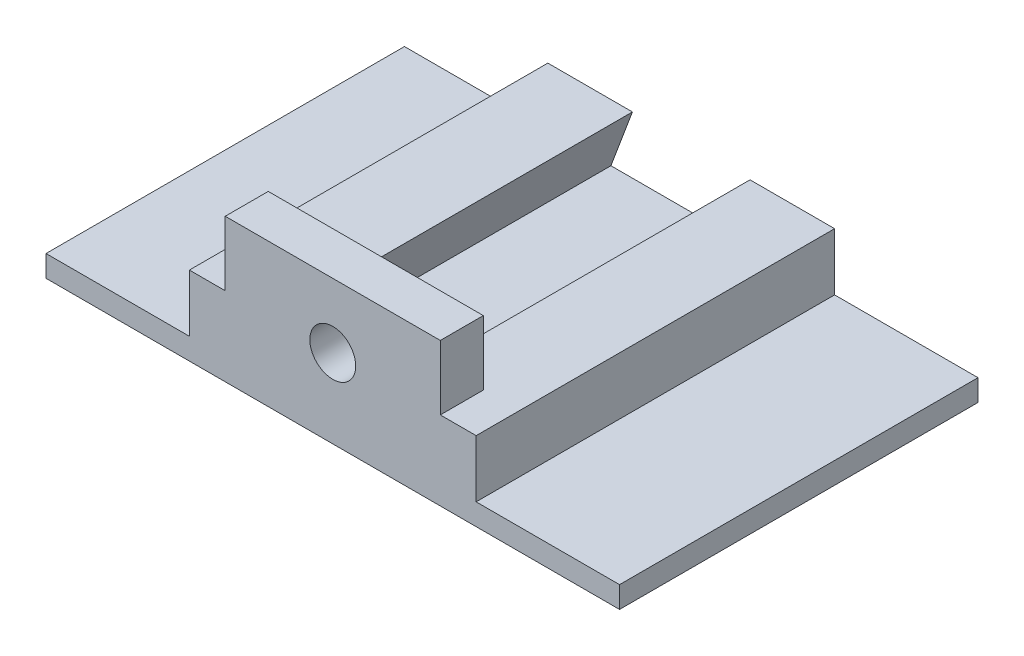
ISO-10303-21;
HEADER;
FILE_DESCRIPTION(('STEP AP214'),'2;1');
FILE_NAME('part.step','',(''),(''),'','','');
FILE_SCHEMA(('AUTOMOTIVE_DESIGN { 1 0 10303 214 1 1 1 1 }'));
ENDSEC;
DATA;
#1=APPLICATION_CONTEXT('core data for automotive mechanical design processes');
#2=APPLICATION_PROTOCOL_DEFINITION('international standard','automotive_design',2000,#1);
#3=PRODUCT_CONTEXT('',#1,'mechanical');
#4=PRODUCT('Part','Part','',(#3));
#5=PRODUCT_RELATED_PRODUCT_CATEGORY('part','',(#4));
#6=PRODUCT_DEFINITION_FORMATION('','',#4);
#7=PRODUCT_DEFINITION_CONTEXT('part definition',#1,'design');
#8=PRODUCT_DEFINITION('design','',#6,#7);
#9=PRODUCT_DEFINITION_SHAPE('','',#8);
#10=(LENGTH_UNIT() NAMED_UNIT(*) SI_UNIT(.MILLI.,.METRE.));
#11=(NAMED_UNIT(*) PLANE_ANGLE_UNIT() SI_UNIT($,.RADIAN.));
#12=(NAMED_UNIT(*) SI_UNIT($,.STERADIAN.) SOLID_ANGLE_UNIT());
#13=UNCERTAINTY_MEASURE_WITH_UNIT(LENGTH_MEASURE(1.E-05),#10,'distance_accuracy_value','');
#14=(GEOMETRIC_REPRESENTATION_CONTEXT(3) GLOBAL_UNCERTAINTY_ASSIGNED_CONTEXT((#13)) GLOBAL_UNIT_ASSIGNED_CONTEXT((#10,
#11,#12)) REPRESENTATION_CONTEXT('',''));
#15=CARTESIAN_POINT('',(0.,0.,0.));
#16=DIRECTION('',(0.,0.,1.));
#17=DIRECTION('',(1.,0.,0.));
#18=AXIS2_PLACEMENT_3D('',#15,#16,#17);
#19=CARTESIAN_POINT('',(0.,0.,25.));
#20=DIRECTION('',(1.,0.,0.));
#21=DIRECTION('',(0.,0.,-1.));
#22=AXIS2_PLACEMENT_3D('',#19,#20,#21);
#23=PLANE('',#22);
#24=DIRECTION('',(0.,-1.,0.));
#25=VECTOR('',#24,1.);
#26=CARTESIAN_POINT('',(0.,0.,25.));
#27=LINE('',#26,#25);
#28=CARTESIAN_POINT('',(0.,1.50000000000001,25.));
#29=VERTEX_POINT('',#28);
#30=CARTESIAN_POINT('',(0.,0.,25.));
#31=VERTEX_POINT('',#30);
#32=EDGE_CURVE('E157',#29,#31,#27,.T.);
#33=ORIENTED_EDGE('',*,*,#32,.F.);
#34=DIRECTION('',(0.,0.,1.));
#35=VECTOR('',#34,1.);
#36=CARTESIAN_POINT('',(0.,1.50000000000001,-8.00000000000001));
#37=LINE('',#36,#35);
#38=CARTESIAN_POINT('',(0.,1.50000000000001,0.));
#39=VERTEX_POINT('',#38);
#40=EDGE_CURVE('E142',#39,#29,#37,.T.);
#41=ORIENTED_EDGE('',*,*,#40,.F.);
#42=DIRECTION('',(0.,-1.,0.));
#43=VECTOR('',#42,1.);
#44=CARTESIAN_POINT('',(0.,0.,0.));
#45=LINE('',#44,#43);
#46=CARTESIAN_POINT('',(0.,0.,0.));
#47=VERTEX_POINT('',#46);
#48=EDGE_CURVE('E183',#39,#47,#45,.T.);
#49=ORIENTED_EDGE('',*,*,#48,.T.);
#50=DIRECTION('',(0.,0.,-1.));
#51=VECTOR('',#50,1.);
#52=CARTESIAN_POINT('',(0.,0.,25.));
#53=LINE('',#52,#51);
#54=EDGE_CURVE('E163',#31,#47,#53,.T.);
#55=ORIENTED_EDGE('',*,*,#54,.F.);
#56=EDGE_LOOP('',(#33,#41,#49,#55));
#57=FACE_BOUND('',#56,.T.);
#58=ADVANCED_FACE('F33',(#57),#23,.F.);
#59=CARTESIAN_POINT('',(0.,0.,25.));
#60=DIRECTION('',(0.,1.,0.));
#61=DIRECTION('',(-1.,0.,0.));
#62=AXIS2_PLACEMENT_3D('',#59,#60,#61);
#63=PLANE('',#62);
#64=DIRECTION('',(0.,0.,-1.));
#65=VECTOR('',#64,1.);
#66=CARTESIAN_POINT('',(40.,0.,25.));
#67=LINE('',#66,#65);
#68=CARTESIAN_POINT('',(40.,0.,25.));
#69=VERTEX_POINT('',#68);
#70=CARTESIAN_POINT('',(40.,0.,0.));
#71=VERTEX_POINT('',#70);
#72=EDGE_CURVE('E208',#69,#71,#67,.T.);
#73=ORIENTED_EDGE('',*,*,#72,.F.);
#74=DIRECTION('',(1.,0.,0.));
#75=VECTOR('',#74,1.);
#76=CARTESIAN_POINT('',(0.,0.,25.));
#77=LINE('',#76,#75);
#78=EDGE_CURVE('E164',#31,#69,#77,.T.);
#79=ORIENTED_EDGE('',*,*,#78,.F.);
#80=ORIENTED_EDGE('',*,*,#54,.T.);
#81=DIRECTION('',(1.,0.,0.));
#82=VECTOR('',#81,1.);
#83=CARTESIAN_POINT('',(0.,0.,0.));
#84=LINE('',#83,#82);
#85=EDGE_CURVE('E185',#47,#71,#84,.T.);
#86=ORIENTED_EDGE('',*,*,#85,.T.);
#87=EDGE_LOOP('',(#73,#79,#80,#86));
#88=FACE_BOUND('',#87,.T.);
#89=ADVANCED_FACE('F309',(#88),#63,.F.);
#90=CARTESIAN_POINT('',(40.,0.,25.));
#91=DIRECTION('',(-1.,0.,0.));
#92=DIRECTION('',(0.,0.,1.));
#93=AXIS2_PLACEMENT_3D('',#90,#91,#92);
#94=PLANE('',#93);
#95=DIRECTION('',(0.,1.,0.));
#96=VECTOR('',#95,1.);
#97=CARTESIAN_POINT('',(40.,0.,0.));
#98=LINE('',#97,#96);
#99=CARTESIAN_POINT('',(40.,1.50000000000001,0.));
#100=VERTEX_POINT('',#99);
#101=EDGE_CURVE('E187',#71,#100,#98,.T.);
#102=ORIENTED_EDGE('',*,*,#101,.T.);
#103=DIRECTION('',(0.,0.,1.));
#104=VECTOR('',#103,1.);
#105=CARTESIAN_POINT('',(40.,1.50000000000001,-8.00000000000001));
#106=LINE('',#105,#104);
#107=CARTESIAN_POINT('',(40.,1.50000000000001,25.));
#108=VERTEX_POINT('',#107);
#109=EDGE_CURVE('E159',#100,#108,#106,.T.);
#110=ORIENTED_EDGE('',*,*,#109,.T.);
#111=DIRECTION('',(0.,1.,0.));
#112=VECTOR('',#111,1.);
#113=CARTESIAN_POINT('',(40.,0.,25.));
#114=LINE('',#113,#112);
#115=EDGE_CURVE('E167',#69,#108,#114,.T.);
#116=ORIENTED_EDGE('',*,*,#115,.F.);
#117=ORIENTED_EDGE('',*,*,#72,.T.);
#118=EDGE_LOOP('',(#102,#110,#116,#117));
#119=FACE_BOUND('',#118,.T.);
#120=ADVANCED_FACE('F306',(#119),#94,.F.);
#121=CARTESIAN_POINT('',(24.1,5.50000000000001,25.));
#122=DIRECTION('',(0.,-1.,0.));
#123=DIRECTION('',(1.,0.,0.));
#124=AXIS2_PLACEMENT_3D('',#121,#122,#123);
#125=PLANE('',#124);
#126=DIRECTION('',(-1.,0.,0.));
#127=VECTOR('',#126,1.);
#128=CARTESIAN_POINT('',(24.1,5.50000000000001,25.));
#129=LINE('',#128,#127);
#130=CARTESIAN_POINT('',(30.,5.5,25.));
#131=VERTEX_POINT('',#130);
#132=CARTESIAN_POINT('',(27.5,5.50000000000001,25.));
#133=VERTEX_POINT('',#132);
#134=EDGE_CURVE('E178',#131,#133,#129,.T.);
#135=ORIENTED_EDGE('',*,*,#134,.F.);
#136=DIRECTION('',(0.,0.,1.));
#137=VECTOR('',#136,1.);
#138=CARTESIAN_POINT('',(30.,5.5,-8.00000000000001));
#139=LINE('',#138,#137);
#140=CARTESIAN_POINT('',(30.,5.5,0.));
#141=VERTEX_POINT('',#140);
#142=EDGE_CURVE('E231',#141,#131,#139,.T.);
#143=ORIENTED_EDGE('',*,*,#142,.F.);
#144=DIRECTION('',(-1.,0.,0.));
#145=VECTOR('',#144,1.);
#146=CARTESIAN_POINT('',(24.1,5.50000000000001,0.));
#147=LINE('',#146,#145);
#148=CARTESIAN_POINT('',(24.1,5.50000000000001,0.));
#149=VERTEX_POINT('',#148);
#150=EDGE_CURVE('E190',#141,#149,#147,.T.);
#151=ORIENTED_EDGE('',*,*,#150,.T.);
#152=DIRECTION('',(0.,0.,-1.));
#153=VECTOR('',#152,1.);
#154=CARTESIAN_POINT('',(24.1,5.50000000000001,25.));
#155=LINE('',#154,#153);
#156=CARTESIAN_POINT('',(24.1,5.50000000000001,22.));
#157=VERTEX_POINT('',#156);
#158=EDGE_CURVE('E205',#157,#149,#155,.T.);
#159=ORIENTED_EDGE('',*,*,#158,.F.);
#160=DIRECTION('',(1.,0.,0.));
#161=VECTOR('',#160,1.);
#162=CARTESIAN_POINT('',(24.1,5.50000000000001,22.));
#163=LINE('',#162,#161);
#164=CARTESIAN_POINT('',(27.5,5.50000000000001,22.));
#165=VERTEX_POINT('',#164);
#166=EDGE_CURVE('E173',#157,#165,#163,.T.);
#167=ORIENTED_EDGE('',*,*,#166,.T.);
#168=DIRECTION('',(0.,0.,1.));
#169=VECTOR('',#168,1.);
#170=CARTESIAN_POINT('',(27.5,5.50000000000001,25.));
#171=LINE('',#170,#169);
#172=EDGE_CURVE('E270',#165,#133,#171,.T.);
#173=ORIENTED_EDGE('',*,*,#172,.T.);
#174=EDGE_LOOP('',(#135,#143,#151,#159,#167,#173));
#175=FACE_BOUND('',#174,.T.);
#176=ADVANCED_FACE('F235',(#175),#125,.F.);
#177=CARTESIAN_POINT('',(25.6,1.50000000000001,25.));
#178=DIRECTION('',(0.936329177569044,0.351123441588393,0.));
#179=DIRECTION('',(-0.351123441588393,0.936329177569044,0.));
#180=AXIS2_PLACEMENT_3D('',#177,#178,#179);
#181=PLANE('',#180);
#182=DIRECTION('',(0.,0.,-1.));
#183=VECTOR('',#182,1.);
#184=CARTESIAN_POINT('',(25.6,1.50000000000001,25.));
#185=LINE('',#184,#183);
#186=CARTESIAN_POINT('',(25.6,1.50000000000001,22.));
#187=VERTEX_POINT('',#186);
#188=CARTESIAN_POINT('',(25.6,1.50000000000001,0.));
#189=VERTEX_POINT('',#188);
#190=EDGE_CURVE('E203',#187,#189,#185,.T.);
#191=ORIENTED_EDGE('',*,*,#190,.F.);
#192=DIRECTION('',(-0.351123441588393,0.936329177569044,0.));
#193=VECTOR('',#192,1.);
#194=CARTESIAN_POINT('',(25.6,1.50000000000001,22.));
#195=LINE('',#194,#193);
#196=EDGE_CURVE('E282',#187,#157,#195,.T.);
#197=ORIENTED_EDGE('',*,*,#196,.T.);
#198=ORIENTED_EDGE('',*,*,#158,.T.);
#199=DIRECTION('',(0.351123441588393,-0.936329177569044,0.));
#200=VECTOR('',#199,1.);
#201=CARTESIAN_POINT('',(25.6,1.50000000000001,0.));
#202=LINE('',#201,#200);
#203=EDGE_CURVE('E192',#149,#189,#202,.T.);
#204=ORIENTED_EDGE('',*,*,#203,.T.);
#205=EDGE_LOOP('',(#191,#197,#198,#204));
#206=FACE_BOUND('',#205,.T.);
#207=ADVANCED_FACE('F325',(#206),#181,.F.);
#208=CARTESIAN_POINT('',(14.4,1.5,25.));
#209=DIRECTION('',(0.,-1.,0.));
#210=DIRECTION('',(1.,0.,0.));
#211=AXIS2_PLACEMENT_3D('',#208,#209,#210);
#212=PLANE('',#211);
#213=DIRECTION('',(0.,0.,-1.));
#214=VECTOR('',#213,1.);
#215=CARTESIAN_POINT('',(14.4,1.5,25.));
#216=LINE('',#215,#214);
#217=CARTESIAN_POINT('',(14.4,1.50000000000001,22.));
#218=VERTEX_POINT('',#217);
#219=CARTESIAN_POINT('',(14.4,1.5,0.));
#220=VERTEX_POINT('',#219);
#221=EDGE_CURVE('E201',#218,#220,#216,.T.);
#222=ORIENTED_EDGE('',*,*,#221,.F.);
#223=DIRECTION('',(1.,0.,0.));
#224=VECTOR('',#223,1.);
#225=CARTESIAN_POINT('',(14.4,1.5,22.));
#226=LINE('',#225,#224);
#227=EDGE_CURVE('E280',#218,#187,#226,.T.);
#228=ORIENTED_EDGE('',*,*,#227,.T.);
#229=ORIENTED_EDGE('',*,*,#190,.T.);
#230=DIRECTION('',(-1.,0.,0.));
#231=VECTOR('',#230,1.);
#232=CARTESIAN_POINT('',(14.4,1.5,0.));
#233=LINE('',#232,#231);
#234=EDGE_CURVE('E195',#189,#220,#233,.T.);
#235=ORIENTED_EDGE('',*,*,#234,.T.);
#236=EDGE_LOOP('',(#222,#228,#229,#235));
#237=FACE_BOUND('',#236,.T.);
#238=ADVANCED_FACE('F324',(#237),#212,.F.);
#239=CARTESIAN_POINT('',(15.9,5.50000000000001,25.));
#240=DIRECTION('',(-0.936329177569044,0.351123441588392,0.));
#241=DIRECTION('',(-0.351123441588392,-0.936329177569045,0.));
#242=AXIS2_PLACEMENT_3D('',#239,#240,#241);
#243=PLANE('',#242);
#244=DIRECTION('',(0.,0.,-1.));
#245=VECTOR('',#244,1.);
#246=CARTESIAN_POINT('',(15.9,5.50000000000001,25.));
#247=LINE('',#246,#245);
#248=CARTESIAN_POINT('',(15.9,5.50000000000001,22.));
#249=VERTEX_POINT('',#248);
#250=CARTESIAN_POINT('',(15.9,5.50000000000001,0.));
#251=VERTEX_POINT('',#250);
#252=EDGE_CURVE('E182',#249,#251,#247,.T.);
#253=ORIENTED_EDGE('',*,*,#252,.F.);
#254=DIRECTION('',(-0.351123441588392,-0.936329177569045,0.));
#255=VECTOR('',#254,1.);
#256=CARTESIAN_POINT('',(15.9,5.50000000000001,22.));
#257=LINE('',#256,#255);
#258=EDGE_CURVE('E277',#249,#218,#257,.T.);
#259=ORIENTED_EDGE('',*,*,#258,.T.);
#260=ORIENTED_EDGE('',*,*,#221,.T.);
#261=DIRECTION('',(0.351123441588392,0.936329177569045,0.));
#262=VECTOR('',#261,1.);
#263=CARTESIAN_POINT('',(15.9,5.50000000000001,0.));
#264=LINE('',#263,#262);
#265=EDGE_CURVE('E170',#220,#251,#264,.T.);
#266=ORIENTED_EDGE('',*,*,#265,.T.);
#267=EDGE_LOOP('',(#253,#259,#260,#266));
#268=FACE_BOUND('',#267,.T.);
#269=ADVANCED_FACE('F320',(#268),#243,.F.);
#270=CARTESIAN_POINT('',(0.,5.5,25.));
#271=DIRECTION('',(0.,-1.,0.));
#272=DIRECTION('',(1.,0.,0.));
#273=AXIS2_PLACEMENT_3D('',#270,#271,#272);
#274=PLANE('',#273);
#275=DIRECTION('',(-1.,0.,0.));
#276=VECTOR('',#275,1.);
#277=CARTESIAN_POINT('',(0.,5.5,0.));
#278=LINE('',#277,#276);
#279=CARTESIAN_POINT('',(10.,5.5,0.));
#280=VERTEX_POINT('',#279);
#281=EDGE_CURVE('E165',#251,#280,#278,.T.);
#282=ORIENTED_EDGE('',*,*,#281,.T.);
#283=DIRECTION('',(0.,0.,1.));
#284=VECTOR('',#283,1.);
#285=CARTESIAN_POINT('',(10.,5.5,-8.00000000000001));
#286=LINE('',#285,#284);
#287=CARTESIAN_POINT('',(10.,5.5,25.));
#288=VERTEX_POINT('',#287);
#289=EDGE_CURVE('E252',#280,#288,#286,.T.);
#290=ORIENTED_EDGE('',*,*,#289,.T.);
#291=DIRECTION('',(-1.,0.,0.));
#292=VECTOR('',#291,1.);
#293=CARTESIAN_POINT('',(0.,5.5,25.));
#294=LINE('',#293,#292);
#295=CARTESIAN_POINT('',(12.5,5.5,25.));
#296=VERTEX_POINT('',#295);
#297=EDGE_CURVE('E180',#296,#288,#294,.T.);
#298=ORIENTED_EDGE('',*,*,#297,.F.);
#299=DIRECTION('',(0.,0.,-1.));
#300=VECTOR('',#299,1.);
#301=CARTESIAN_POINT('',(12.5,5.5,25.));
#302=LINE('',#301,#300);
#303=CARTESIAN_POINT('',(12.5,5.50000000000001,22.));
#304=VERTEX_POINT('',#303);
#305=EDGE_CURVE('E274',#296,#304,#302,.T.);
#306=ORIENTED_EDGE('',*,*,#305,.T.);
#307=DIRECTION('',(1.,0.,0.));
#308=VECTOR('',#307,1.);
#309=CARTESIAN_POINT('',(0.,5.5,22.));
#310=LINE('',#309,#308);
#311=EDGE_CURVE('E212',#304,#249,#310,.T.);
#312=ORIENTED_EDGE('',*,*,#311,.T.);
#313=ORIENTED_EDGE('',*,*,#252,.T.);
#314=EDGE_LOOP('',(#282,#290,#298,#306,#312,#313));
#315=FACE_BOUND('',#314,.T.);
#316=ADVANCED_FACE('F316',(#315),#274,.F.);
#317=CARTESIAN_POINT('',(0.,0.,25.));
#318=DIRECTION('',(0.,0.,-1.));
#319=DIRECTION('',(-1.,0.,0.));
#320=AXIS2_PLACEMENT_3D('',#317,#318,#319);
#321=PLANE('',#320);
#322=ORIENTED_EDGE('',*,*,#297,.T.);
#323=DIRECTION('',(0.,1.,0.));
#324=VECTOR('',#323,1.);
#325=CARTESIAN_POINT('',(10.,5.5,25.));
#326=LINE('',#325,#324);
#327=CARTESIAN_POINT('',(10.,1.50000000000001,25.));
#328=VERTEX_POINT('',#327);
#329=EDGE_CURVE('E151',#328,#288,#326,.T.);
#330=ORIENTED_EDGE('',*,*,#329,.F.);
#331=DIRECTION('',(1.,0.,0.));
#332=VECTOR('',#331,1.);
#333=CARTESIAN_POINT('',(0.,1.50000000000001,25.));
#334=LINE('',#333,#332);
#335=EDGE_CURVE('E145',#29,#328,#334,.T.);
#336=ORIENTED_EDGE('',*,*,#335,.F.);
#337=ORIENTED_EDGE('',*,*,#32,.T.);
#338=ORIENTED_EDGE('',*,*,#78,.T.);
#339=ORIENTED_EDGE('',*,*,#115,.T.);
#340=DIRECTION('',(1.,0.,0.));
#341=VECTOR('',#340,1.);
#342=CARTESIAN_POINT('',(40.,1.50000000000001,25.));
#343=LINE('',#342,#341);
#344=CARTESIAN_POINT('',(30.,1.50000000000001,25.));
#345=VERTEX_POINT('',#344);
#346=EDGE_CURVE('E238',#345,#108,#343,.T.);
#347=ORIENTED_EDGE('',*,*,#346,.F.);
#348=DIRECTION('',(0.,-1.,0.));
#349=VECTOR('',#348,1.);
#350=CARTESIAN_POINT('',(30.,5.5,25.));
#351=LINE('',#350,#349);
#352=EDGE_CURVE('E241',#131,#345,#351,.T.);
#353=ORIENTED_EDGE('',*,*,#352,.F.);
#354=ORIENTED_EDGE('',*,*,#134,.T.);
#355=DIRECTION('',(0.,1.,0.));
#356=VECTOR('',#355,1.);
#357=CARTESIAN_POINT('',(27.5,0.,25.));
#358=LINE('',#357,#356);
#359=CARTESIAN_POINT('',(27.5,10.,25.));
#360=VERTEX_POINT('',#359);
#361=EDGE_CURVE('E264',#133,#360,#358,.T.);
#362=ORIENTED_EDGE('',*,*,#361,.T.);
#363=DIRECTION('',(-1.,0.,0.));
#364=VECTOR('',#363,1.);
#365=CARTESIAN_POINT('',(12.5,10.,25.));
#366=LINE('',#365,#364);
#367=CARTESIAN_POINT('',(12.5,10.,25.));
#368=VERTEX_POINT('',#367);
#369=EDGE_CURVE('E257',#360,#368,#366,.T.);
#370=ORIENTED_EDGE('',*,*,#369,.T.);
#371=DIRECTION('',(0.,-1.,0.));
#372=VECTOR('',#371,1.);
#373=CARTESIAN_POINT('',(12.5,0.,25.));
#374=LINE('',#373,#372);
#375=EDGE_CURVE('E248',#368,#296,#374,.T.);
#376=ORIENTED_EDGE('',*,*,#375,.T.);
#377=EDGE_LOOP('',(#322,#330,#336,#337,#338,#339,#347,#353,#354,#362,#370,#376));
#378=FACE_BOUND('',#377,.T.);
#379=CARTESIAN_POINT('',(20.,5.50000000000001,25.));
#380=DIRECTION('',(0.,0.,1.));
#381=DIRECTION('',(1.,0.,0.));
#382=AXIS2_PLACEMENT_3D('',#379,#380,#381);
#383=CIRCLE('',#382,1.6);
#384=CARTESIAN_POINT('',(21.6,5.50000000000001,25.));
#385=VERTEX_POINT('',#384);
#386=EDGE_CURVE('E249',#385,#385,#383,.T.);
#387=ORIENTED_EDGE('',*,*,#386,.F.);
#388=EDGE_LOOP('',(#387));
#389=FACE_BOUND('',#388,.T.);
#390=ADVANCED_FACE('F155',(#378,#389),#321,.F.);
#391=CARTESIAN_POINT('',(0.,0.,0.));
#392=DIRECTION('',(0.,0.,-1.));
#393=DIRECTION('',(-1.,0.,0.));
#394=AXIS2_PLACEMENT_3D('',#391,#392,#393);
#395=PLANE('',#394);
#396=DIRECTION('',(0.,-1.,0.));
#397=VECTOR('',#396,1.);
#398=CARTESIAN_POINT('',(10.,0.,0.));
#399=LINE('',#398,#397);
#400=CARTESIAN_POINT('',(10.,1.50000000000001,0.));
#401=VERTEX_POINT('',#400);
#402=EDGE_CURVE('E11',#280,#401,#399,.T.);
#403=ORIENTED_EDGE('',*,*,#402,.F.);
#404=ORIENTED_EDGE('',*,*,#281,.F.);
#405=ORIENTED_EDGE('',*,*,#265,.F.);
#406=ORIENTED_EDGE('',*,*,#234,.F.);
#407=ORIENTED_EDGE('',*,*,#203,.F.);
#408=ORIENTED_EDGE('',*,*,#150,.F.);
#409=DIRECTION('',(0.,1.,0.));
#410=VECTOR('',#409,1.);
#411=CARTESIAN_POINT('',(30.,0.,0.));
#412=LINE('',#411,#410);
#413=CARTESIAN_POINT('',(30.,1.50000000000001,0.));
#414=VERTEX_POINT('',#413);
#415=EDGE_CURVE('E215',#414,#141,#412,.T.);
#416=ORIENTED_EDGE('',*,*,#415,.F.);
#417=DIRECTION('',(-1.,0.,0.));
#418=VECTOR('',#417,1.);
#419=CARTESIAN_POINT('',(0.,1.50000000000001,0.));
#420=LINE('',#419,#418);
#421=EDGE_CURVE('E217',#100,#414,#420,.T.);
#422=ORIENTED_EDGE('',*,*,#421,.F.);
#423=ORIENTED_EDGE('',*,*,#101,.F.);
#424=ORIENTED_EDGE('',*,*,#85,.F.);
#425=ORIENTED_EDGE('',*,*,#48,.F.);
#426=DIRECTION('',(-1.,0.,0.));
#427=VECTOR('',#426,1.);
#428=CARTESIAN_POINT('',(0.,1.50000000000001,0.));
#429=LINE('',#428,#427);
#430=EDGE_CURVE('E40',#401,#39,#429,.T.);
#431=ORIENTED_EDGE('',*,*,#430,.F.);
#432=EDGE_LOOP('',(#403,#404,#405,#406,#407,#408,#416,#422,#423,#424,#425,#431));
#433=FACE_BOUND('',#432,.T.);
#434=ADVANCED_FACE('F227',(#433),#395,.T.);
#435=CARTESIAN_POINT('',(0.,0.,22.));
#436=DIRECTION('',(0.,0.,-1.));
#437=DIRECTION('',(-1.,0.,0.));
#438=AXIS2_PLACEMENT_3D('',#435,#436,#437);
#439=PLANE('',#438);
#440=CARTESIAN_POINT('',(20.,5.50000000000001,22.));
#441=DIRECTION('',(0.,0.,1.));
#442=DIRECTION('',(1.,0.,0.));
#443=AXIS2_PLACEMENT_3D('',#440,#441,#442);
#444=CIRCLE('',#443,1.6);
#445=CARTESIAN_POINT('',(21.6,5.50000000000001,22.));
#446=VERTEX_POINT('',#445);
#447=EDGE_CURVE('E245',#446,#446,#444,.T.);
#448=ORIENTED_EDGE('',*,*,#447,.T.);
#449=EDGE_LOOP('',(#448));
#450=FACE_BOUND('',#449,.T.);
#451=ORIENTED_EDGE('',*,*,#166,.F.);
#452=ORIENTED_EDGE('',*,*,#196,.F.);
#453=ORIENTED_EDGE('',*,*,#227,.F.);
#454=ORIENTED_EDGE('',*,*,#258,.F.);
#455=ORIENTED_EDGE('',*,*,#311,.F.);
#456=DIRECTION('',(0.,-1.,0.));
#457=VECTOR('',#456,1.);
#458=CARTESIAN_POINT('',(12.5,0.,22.));
#459=LINE('',#458,#457);
#460=CARTESIAN_POINT('',(12.5,10.,22.));
#461=VERTEX_POINT('',#460);
#462=EDGE_CURVE('E253',#461,#304,#459,.T.);
#463=ORIENTED_EDGE('',*,*,#462,.F.);
#464=DIRECTION('',(-1.,0.,0.));
#465=VECTOR('',#464,1.);
#466=CARTESIAN_POINT('',(12.5,10.,22.));
#467=LINE('',#466,#465);
#468=CARTESIAN_POINT('',(27.5,10.,22.));
#469=VERTEX_POINT('',#468);
#470=EDGE_CURVE('E259',#469,#461,#467,.T.);
#471=ORIENTED_EDGE('',*,*,#470,.F.);
#472=DIRECTION('',(0.,1.,0.));
#473=VECTOR('',#472,1.);
#474=CARTESIAN_POINT('',(27.5,0.,22.));
#475=LINE('',#474,#473);
#476=EDGE_CURVE('E256',#165,#469,#475,.T.);
#477=ORIENTED_EDGE('',*,*,#476,.F.);
#478=EDGE_LOOP('',(#451,#452,#453,#454,#455,#463,#471,#477));
#479=FACE_BOUND('',#478,.T.);
#480=ADVANCED_FACE('F289',(#450,#479),#439,.T.);
#481=CARTESIAN_POINT('',(12.5,0.,22.));
#482=DIRECTION('',(-1.,0.,0.));
#483=DIRECTION('',(0.,0.,1.));
#484=AXIS2_PLACEMENT_3D('',#481,#482,#483);
#485=PLANE('',#484);
#486=ORIENTED_EDGE('',*,*,#305,.F.);
#487=ORIENTED_EDGE('',*,*,#375,.F.);
#488=DIRECTION('',(0.,0.,1.));
#489=VECTOR('',#488,1.);
#490=CARTESIAN_POINT('',(12.5,10.,22.));
#491=LINE('',#490,#489);
#492=EDGE_CURVE('E268',#461,#368,#491,.T.);
#493=ORIENTED_EDGE('',*,*,#492,.F.);
#494=ORIENTED_EDGE('',*,*,#462,.T.);
#495=EDGE_LOOP('',(#486,#487,#493,#494));
#496=FACE_BOUND('',#495,.T.);
#497=ADVANCED_FACE('F422',(#496),#485,.T.);
#498=CARTESIAN_POINT('',(27.5,0.,22.));
#499=DIRECTION('',(1.,0.,0.));
#500=DIRECTION('',(0.,0.,-1.));
#501=AXIS2_PLACEMENT_3D('',#498,#499,#500);
#502=PLANE('',#501);
#503=ORIENTED_EDGE('',*,*,#172,.F.);
#504=ORIENTED_EDGE('',*,*,#476,.T.);
#505=DIRECTION('',(0.,0.,1.));
#506=VECTOR('',#505,1.);
#507=CARTESIAN_POINT('',(27.5,10.,22.));
#508=LINE('',#507,#506);
#509=EDGE_CURVE('E262',#469,#360,#508,.T.);
#510=ORIENTED_EDGE('',*,*,#509,.T.);
#511=ORIENTED_EDGE('',*,*,#361,.F.);
#512=EDGE_LOOP('',(#503,#504,#510,#511));
#513=FACE_BOUND('',#512,.T.);
#514=ADVANCED_FACE('F294',(#513),#502,.T.);
#515=CARTESIAN_POINT('',(12.5,10.,22.));
#516=DIRECTION('',(0.,1.,0.));
#517=DIRECTION('',(0.,0.,1.));
#518=AXIS2_PLACEMENT_3D('',#515,#516,#517);
#519=PLANE('',#518);
#520=ORIENTED_EDGE('',*,*,#369,.F.);
#521=ORIENTED_EDGE('',*,*,#509,.F.);
#522=ORIENTED_EDGE('',*,*,#470,.T.);
#523=ORIENTED_EDGE('',*,*,#492,.T.);
#524=EDGE_LOOP('',(#520,#521,#522,#523));
#525=FACE_BOUND('',#524,.T.);
#526=ADVANCED_FACE('F298',(#525),#519,.T.);
#527=CARTESIAN_POINT('',(20.,5.50000000000001,22.));
#528=DIRECTION('',(0.,0.,1.));
#529=DIRECTION('',(1.,0.,0.));
#530=AXIS2_PLACEMENT_3D('',#527,#528,#529);
#531=CYLINDRICAL_SURFACE('',#530,1.6);
#532=ORIENTED_EDGE('',*,*,#447,.F.);
#533=EDGE_LOOP('',(#532));
#534=FACE_BOUND('',#533,.T.);
#535=ORIENTED_EDGE('',*,*,#386,.T.);
#536=EDGE_LOOP('',(#535));
#537=FACE_BOUND('',#536,.T.);
#538=ADVANCED_FACE('F387',(#534,#537),#531,.F.);
#539=CARTESIAN_POINT('',(40.,1.50000000000001,-8.00000000000001));
#540=DIRECTION('',(0.,-1.,0.));
#541=DIRECTION('',(0.,0.,-1.));
#542=AXIS2_PLACEMENT_3D('',#539,#540,#541);
#543=PLANE('',#542);
#544=ORIENTED_EDGE('',*,*,#421,.T.);
#545=DIRECTION('',(0.,0.,1.));
#546=VECTOR('',#545,1.);
#547=CARTESIAN_POINT('',(30.,1.50000000000001,-8.00000000000001));
#548=LINE('',#547,#546);
#549=EDGE_CURVE('E54',#414,#345,#548,.T.);
#550=ORIENTED_EDGE('',*,*,#549,.T.);
#551=ORIENTED_EDGE('',*,*,#346,.T.);
#552=ORIENTED_EDGE('',*,*,#109,.F.);
#553=EDGE_LOOP('',(#544,#550,#551,#552));
#554=FACE_BOUND('',#553,.T.);
#555=ADVANCED_FACE('F221',(#554),#543,.F.);
#556=CARTESIAN_POINT('',(30.,5.5,-8.00000000000001));
#557=DIRECTION('',(-1.,0.,0.));
#558=DIRECTION('',(0.,0.,1.));
#559=AXIS2_PLACEMENT_3D('',#556,#557,#558);
#560=PLANE('',#559);
#561=ORIENTED_EDGE('',*,*,#415,.T.);
#562=ORIENTED_EDGE('',*,*,#142,.T.);
#563=ORIENTED_EDGE('',*,*,#352,.T.);
#564=ORIENTED_EDGE('',*,*,#549,.F.);
#565=EDGE_LOOP('',(#561,#562,#563,#564));
#566=FACE_BOUND('',#565,.T.);
#567=ADVANCED_FACE('F230',(#566),#560,.F.);
#568=CARTESIAN_POINT('',(10.,5.5,-8.00000000000001));
#569=DIRECTION('',(1.,0.,0.));
#570=DIRECTION('',(0.,0.,-1.));
#571=AXIS2_PLACEMENT_3D('',#568,#569,#570);
#572=PLANE('',#571);
#573=ORIENTED_EDGE('',*,*,#402,.T.);
#574=DIRECTION('',(0.,0.,1.));
#575=VECTOR('',#574,1.);
#576=CARTESIAN_POINT('',(10.,1.50000000000001,-8.00000000000001));
#577=LINE('',#576,#575);
#578=EDGE_CURVE('E47',#401,#328,#577,.T.);
#579=ORIENTED_EDGE('',*,*,#578,.T.);
#580=ORIENTED_EDGE('',*,*,#329,.T.);
#581=ORIENTED_EDGE('',*,*,#289,.F.);
#582=EDGE_LOOP('',(#573,#579,#580,#581));
#583=FACE_BOUND('',#582,.T.);
#584=ADVANCED_FACE('F398',(#583),#572,.F.);
#585=CARTESIAN_POINT('',(0.,1.50000000000001,-8.00000000000001));
#586=DIRECTION('',(0.,-1.,0.));
#587=DIRECTION('',(0.,0.,-1.));
#588=AXIS2_PLACEMENT_3D('',#585,#586,#587);
#589=PLANE('',#588);
#590=ORIENTED_EDGE('',*,*,#430,.T.);
#591=ORIENTED_EDGE('',*,*,#40,.T.);
#592=ORIENTED_EDGE('',*,*,#335,.T.);
#593=ORIENTED_EDGE('',*,*,#578,.F.);
#594=EDGE_LOOP('',(#590,#591,#592,#593));
#595=FACE_BOUND('',#594,.T.);
#596=ADVANCED_FACE('F144',(#595),#589,.F.);
#597=CLOSED_SHELL('',(#58,#89,#120,#176,#207,#238,#269,#316,#390,#434,#480,#497,#514,#526,#538,
#555,#567,#584,#596));
#598=MANIFOLD_SOLID_BREP('B2',#597);
#599=ADVANCED_BREP_SHAPE_REPRESENTATION('',(#18,#598),#14);
#600=SHAPE_DEFINITION_REPRESENTATION(#9,#599);
ENDSEC;
END-ISO-10303-21;
